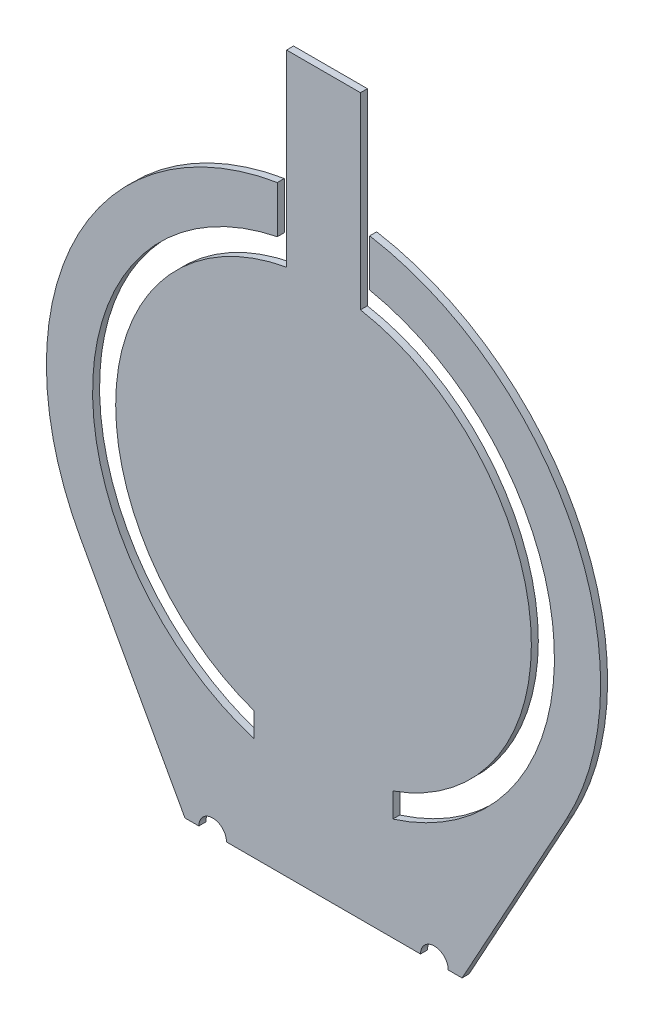
ISO-10303-21;
HEADER;
FILE_DESCRIPTION(('STEP AP214'),'2;1');
FILE_NAME('part.step','',(''),(''),'','','');
FILE_SCHEMA(('AUTOMOTIVE_DESIGN { 1 0 10303 214 1 1 1 1 }'));
ENDSEC;
DATA;
#1=APPLICATION_CONTEXT('core data for automotive mechanical design processes');
#2=APPLICATION_PROTOCOL_DEFINITION('international standard','automotive_design',2000,#1);
#3=PRODUCT_CONTEXT('',#1,'mechanical');
#4=PRODUCT('Part','Part','',(#3));
#5=PRODUCT_RELATED_PRODUCT_CATEGORY('part','',(#4));
#6=PRODUCT_DEFINITION_FORMATION('','',#4);
#7=PRODUCT_DEFINITION_CONTEXT('part definition',#1,'design');
#8=PRODUCT_DEFINITION('design','',#6,#7);
#9=PRODUCT_DEFINITION_SHAPE('','',#8);
#10=(LENGTH_UNIT() NAMED_UNIT(*) SI_UNIT(.MILLI.,.METRE.));
#11=(NAMED_UNIT(*) PLANE_ANGLE_UNIT() SI_UNIT($,.RADIAN.));
#12=(NAMED_UNIT(*) SI_UNIT($,.STERADIAN.) SOLID_ANGLE_UNIT());
#13=UNCERTAINTY_MEASURE_WITH_UNIT(LENGTH_MEASURE(1.E-05),#10,'distance_accuracy_value','');
#14=(GEOMETRIC_REPRESENTATION_CONTEXT(3) GLOBAL_UNCERTAINTY_ASSIGNED_CONTEXT((#13)) GLOBAL_UNIT_ASSIGNED_CONTEXT((#10,
#11,#12)) REPRESENTATION_CONTEXT('',''));
#15=CARTESIAN_POINT('',(0.,0.,0.));
#16=DIRECTION('',(0.,0.,1.));
#17=DIRECTION('',(1.,0.,0.));
#18=AXIS2_PLACEMENT_3D('',#15,#16,#17);
#19=CARTESIAN_POINT('',(0.,0.,0.75438));
#20=DIRECTION('',(0.,0.,1.));
#21=DIRECTION('',(1.,0.,0.));
#22=AXIS2_PLACEMENT_3D('',#19,#20,#21);
#23=PLANE('',#22);
#24=CARTESIAN_POINT('',(-12.,-35.,0.75438));
#25=DIRECTION('',(0.,0.,1.));
#26=DIRECTION('',(1.,0.,0.));
#27=AXIS2_PLACEMENT_3D('',#24,#25,#26);
#28=CIRCLE('',#27,1.5);
#29=CARTESIAN_POINT('',(-10.5,-35.,0.75438));
#30=VERTEX_POINT('',#29);
#31=CARTESIAN_POINT('',(-13.5,-35.,0.75438));
#32=VERTEX_POINT('',#31);
#33=EDGE_CURVE('E182',#30,#32,#28,.T.);
#34=ORIENTED_EDGE('',*,*,#33,.F.);
#35=DIRECTION('',(1.,0.,0.));
#36=VECTOR('',#35,1.);
#37=CARTESIAN_POINT('',(0.,-35.,0.75438));
#38=LINE('',#37,#36);
#39=CARTESIAN_POINT('',(10.5,-35.,0.75438));
#40=VERTEX_POINT('',#39);
#41=EDGE_CURVE('E193',#30,#40,#38,.T.);
#42=ORIENTED_EDGE('',*,*,#41,.T.);
#43=CARTESIAN_POINT('',(12.,-35.,0.75438));
#44=DIRECTION('',(0.,0.,1.));
#45=DIRECTION('',(1.,0.,0.));
#46=AXIS2_PLACEMENT_3D('',#43,#44,#45);
#47=CIRCLE('',#46,1.5);
#48=CARTESIAN_POINT('',(13.5,-35.,0.75438));
#49=VERTEX_POINT('',#48);
#50=EDGE_CURVE('E198',#40,#49,#47,.F.);
#51=ORIENTED_EDGE('',*,*,#50,.T.);
#52=CARTESIAN_POINT('',(15.,-35.,0.75438));
#53=VERTEX_POINT('',#52);
#54=EDGE_CURVE('E203',#49,#53,#38,.T.);
#55=ORIENTED_EDGE('',*,*,#54,.T.);
#56=DIRECTION('',(0.481530219319478,0.876429488254552,0.));
#57=VECTOR('',#56,1.);
#58=CARTESIAN_POINT('',(26.2928846476366,-14.4459065795844,0.75438));
#59=LINE('',#58,#57);
#60=CARTESIAN_POINT('',(26.2928846476366,-14.4459065795843,0.75438));
#61=VERTEX_POINT('',#60);
#62=EDGE_CURVE('E307',#53,#61,#59,.T.);
#63=ORIENTED_EDGE('',*,*,#62,.T.);
#64=CARTESIAN_POINT('',(0.,0.,0.75438));
#65=DIRECTION('',(0.,0.,1.));
#66=DIRECTION('',(1.,0.,0.));
#67=AXIS2_PLACEMENT_3D('',#64,#65,#66);
#68=CIRCLE('',#67,30.);
#69=CARTESIAN_POINT('',(5.,29.5803989154981,0.75438));
#70=VERTEX_POINT('',#69);
#71=EDGE_CURVE('E312',#61,#70,#68,.T.);
#72=ORIENTED_EDGE('',*,*,#71,.T.);
#73=DIRECTION('',(0.,1.,0.));
#74=VECTOR('',#73,1.);
#75=CARTESIAN_POINT('',(5.,0.,0.75438));
#76=LINE('',#75,#74);
#77=CARTESIAN_POINT('',(5.,24.4948974278318,0.75438));
#78=VERTEX_POINT('',#77);
#79=EDGE_CURVE('E349',#78,#70,#76,.T.);
#80=ORIENTED_EDGE('',*,*,#79,.F.);
#81=CARTESIAN_POINT('',(0.,0.,0.75438));
#82=DIRECTION('',(0.,0.,1.));
#83=DIRECTION('',(1.,0.,0.));
#84=AXIS2_PLACEMENT_3D('',#81,#82,#83);
#85=CIRCLE('',#84,25.);
#86=CARTESIAN_POINT('',(7.5,-23.8484800354236,0.75438));
#87=VERTEX_POINT('',#86);
#88=EDGE_CURVE('E333',#87,#78,#85,.T.);
#89=ORIENTED_EDGE('',*,*,#88,.F.);
#90=DIRECTION('',(0.,1.,0.));
#91=VECTOR('',#90,1.);
#92=CARTESIAN_POINT('',(7.5,0.,0.75438));
#93=LINE('',#92,#91);
#94=CARTESIAN_POINT('',(7.5,-21.2132034355964,0.75438));
#95=VERTEX_POINT('',#94);
#96=EDGE_CURVE('E330',#87,#95,#93,.T.);
#97=ORIENTED_EDGE('',*,*,#96,.T.);
#98=CARTESIAN_POINT('',(0.,0.,0.75438));
#99=DIRECTION('',(0.,0.,1.));
#100=DIRECTION('',(1.,0.,0.));
#101=AXIS2_PLACEMENT_3D('',#98,#99,#100);
#102=CIRCLE('',#101,22.5);
#103=CARTESIAN_POINT('',(4.,22.1415898254845,0.75438));
#104=VERTEX_POINT('',#103);
#105=EDGE_CURVE('E323',#95,#104,#102,.T.);
#106=ORIENTED_EDGE('',*,*,#105,.T.);
#107=DIRECTION('',(0.,1.,0.));
#108=VECTOR('',#107,1.);
#109=CARTESIAN_POINT('',(4.,0.,0.75438));
#110=LINE('',#109,#108);
#111=CARTESIAN_POINT('',(4.,42.5,0.75438));
#112=VERTEX_POINT('',#111);
#113=EDGE_CURVE('E379',#104,#112,#110,.T.);
#114=ORIENTED_EDGE('',*,*,#113,.T.);
#115=DIRECTION('',(-1.,0.,0.));
#116=VECTOR('',#115,1.);
#117=CARTESIAN_POINT('',(0.,42.5,0.75438));
#118=LINE('',#117,#116);
#119=CARTESIAN_POINT('',(-4.,42.5,0.75438));
#120=VERTEX_POINT('',#119);
#121=EDGE_CURVE('E375',#112,#120,#118,.T.);
#122=ORIENTED_EDGE('',*,*,#121,.T.);
#123=DIRECTION('',(0.,1.,0.));
#124=VECTOR('',#123,1.);
#125=CARTESIAN_POINT('',(-4.,0.,0.75438));
#126=LINE('',#125,#124);
#127=CARTESIAN_POINT('',(-4.,22.1415898254845,0.75438));
#128=VERTEX_POINT('',#127);
#129=EDGE_CURVE('E370',#128,#120,#126,.T.);
#130=ORIENTED_EDGE('',*,*,#129,.F.);
#131=CARTESIAN_POINT('',(-7.5,-21.2132034355964,0.75438));
#132=VERTEX_POINT('',#131);
#133=EDGE_CURVE('E329',#128,#132,#102,.T.);
#134=ORIENTED_EDGE('',*,*,#133,.T.);
#135=DIRECTION('',(0.,1.,0.));
#136=VECTOR('',#135,1.);
#137=CARTESIAN_POINT('',(-7.5,0.,0.75438));
#138=LINE('',#137,#136);
#139=CARTESIAN_POINT('',(-7.5,-23.8484800354236,0.75438));
#140=VERTEX_POINT('',#139);
#141=EDGE_CURVE('E318',#140,#132,#138,.T.);
#142=ORIENTED_EDGE('',*,*,#141,.F.);
#143=CARTESIAN_POINT('',(-5.,24.4948974278318,0.75438));
#144=VERTEX_POINT('',#143);
#145=EDGE_CURVE('E247',#144,#140,#85,.T.);
#146=ORIENTED_EDGE('',*,*,#145,.F.);
#147=DIRECTION('',(0.,1.,0.));
#148=VECTOR('',#147,1.);
#149=CARTESIAN_POINT('',(-5.,0.,0.75438));
#150=LINE('',#149,#148);
#151=CARTESIAN_POINT('',(-5.,29.5803989154981,0.75438));
#152=VERTEX_POINT('',#151);
#153=EDGE_CURVE('E352',#144,#152,#150,.T.);
#154=ORIENTED_EDGE('',*,*,#153,.T.);
#155=CARTESIAN_POINT('',(-26.2928846476366,-14.4459065795843,0.75438));
#156=VERTEX_POINT('',#155);
#157=EDGE_CURVE('E316',#152,#156,#68,.T.);
#158=ORIENTED_EDGE('',*,*,#157,.T.);
#159=DIRECTION('',(-0.481530219319478,0.876429488254552,0.));
#160=VECTOR('',#159,1.);
#161=CARTESIAN_POINT('',(-26.2928846476366,-14.4459065795843,0.75438));
#162=LINE('',#161,#160);
#163=CARTESIAN_POINT('',(-15.,-35.,0.75438));
#164=VERTEX_POINT('',#163);
#165=EDGE_CURVE('E208',#164,#156,#162,.T.);
#166=ORIENTED_EDGE('',*,*,#165,.F.);
#167=EDGE_CURVE('E196',#164,#32,#38,.T.);
#168=ORIENTED_EDGE('',*,*,#167,.T.);
#169=EDGE_LOOP('',(#34,#42,#51,#55,#63,#72,#80,#89,#97,#106,#114,#122,#130,#134,#142,#146,#154,
#158,#166,#168));
#170=FACE_BOUND('',#169,.T.);
#171=ADVANCED_FACE('F45',(#170),#23,.T.);
#172=CARTESIAN_POINT('',(0.,0.,0.));
#173=DIRECTION('',(0.,0.,1.));
#174=DIRECTION('',(1.,0.,0.));
#175=AXIS2_PLACEMENT_3D('',#172,#173,#174);
#176=PLANE('',#175);
#177=DIRECTION('',(1.,0.,0.));
#178=VECTOR('',#177,1.);
#179=CARTESIAN_POINT('',(0.,-35.,0.));
#180=LINE('',#179,#178);
#181=CARTESIAN_POINT('',(-10.5,-35.,0.));
#182=VERTEX_POINT('',#181);
#183=CARTESIAN_POINT('',(10.5,-35.,0.));
#184=VERTEX_POINT('',#183);
#185=EDGE_CURVE('E248',#182,#184,#180,.T.);
#186=ORIENTED_EDGE('',*,*,#185,.F.);
#187=CARTESIAN_POINT('',(-12.,-35.,0.));
#188=DIRECTION('',(0.,0.,1.));
#189=DIRECTION('',(1.,0.,0.));
#190=AXIS2_PLACEMENT_3D('',#187,#188,#189);
#191=CIRCLE('',#190,1.5);
#192=CARTESIAN_POINT('',(-13.5,-35.,0.));
#193=VERTEX_POINT('',#192);
#194=EDGE_CURVE('E69',#182,#193,#191,.T.);
#195=ORIENTED_EDGE('',*,*,#194,.T.);
#196=CARTESIAN_POINT('',(-15.,-35.,0.));
#197=VERTEX_POINT('',#196);
#198=EDGE_CURVE('E243',#197,#193,#180,.T.);
#199=ORIENTED_EDGE('',*,*,#198,.F.);
#200=DIRECTION('',(-0.481530219319478,0.876429488254552,0.));
#201=VECTOR('',#200,1.);
#202=CARTESIAN_POINT('',(-26.2928846476366,-14.4459065795843,0.));
#203=LINE('',#202,#201);
#204=CARTESIAN_POINT('',(-26.2928846476366,-14.4459065795843,0.));
#205=VERTEX_POINT('',#204);
#206=EDGE_CURVE('E238',#197,#205,#203,.T.);
#207=ORIENTED_EDGE('',*,*,#206,.T.);
#208=CARTESIAN_POINT('',(0.,0.,0.));
#209=DIRECTION('',(0.,0.,1.));
#210=DIRECTION('',(1.,0.,0.));
#211=AXIS2_PLACEMENT_3D('',#208,#209,#210);
#212=CIRCLE('',#211,30.);
#213=CARTESIAN_POINT('',(-5.,29.5803989154981,0.));
#214=VERTEX_POINT('',#213);
#215=EDGE_CURVE('E233',#214,#205,#212,.T.);
#216=ORIENTED_EDGE('',*,*,#215,.F.);
#217=DIRECTION('',(0.,1.,0.));
#218=VECTOR('',#217,1.);
#219=CARTESIAN_POINT('',(-5.,0.,0.));
#220=LINE('',#219,#218);
#221=CARTESIAN_POINT('',(-5.,24.4948974278318,0.));
#222=VERTEX_POINT('',#221);
#223=EDGE_CURVE('E282',#222,#214,#220,.T.);
#224=ORIENTED_EDGE('',*,*,#223,.F.);
#225=CARTESIAN_POINT('',(0.,0.,0.));
#226=DIRECTION('',(0.,0.,1.));
#227=DIRECTION('',(1.,0.,0.));
#228=AXIS2_PLACEMENT_3D('',#225,#226,#227);
#229=CIRCLE('',#228,25.);
#230=CARTESIAN_POINT('',(-7.5,-23.8484800354236,0.));
#231=VERTEX_POINT('',#230);
#232=EDGE_CURVE('E217',#222,#231,#229,.T.);
#233=ORIENTED_EDGE('',*,*,#232,.T.);
#234=DIRECTION('',(0.,1.,0.));
#235=VECTOR('',#234,1.);
#236=CARTESIAN_POINT('',(-7.5,0.,0.));
#237=LINE('',#236,#235);
#238=CARTESIAN_POINT('',(-7.5,-21.2132034355964,0.));
#239=VERTEX_POINT('',#238);
#240=EDGE_CURVE('E225',#231,#239,#237,.T.);
#241=ORIENTED_EDGE('',*,*,#240,.T.);
#242=CARTESIAN_POINT('',(0.,0.,0.));
#243=DIRECTION('',(0.,0.,1.));
#244=DIRECTION('',(1.,0.,0.));
#245=AXIS2_PLACEMENT_3D('',#242,#243,#244);
#246=CIRCLE('',#245,22.5);
#247=CARTESIAN_POINT('',(-4.,22.1415898254845,0.));
#248=VERTEX_POINT('',#247);
#249=EDGE_CURVE('E220',#248,#239,#246,.T.);
#250=ORIENTED_EDGE('',*,*,#249,.F.);
#251=DIRECTION('',(0.,1.,0.));
#252=VECTOR('',#251,1.);
#253=CARTESIAN_POINT('',(-4.,0.,0.));
#254=LINE('',#253,#252);
#255=CARTESIAN_POINT('',(-4.,42.5,0.));
#256=VERTEX_POINT('',#255);
#257=EDGE_CURVE('E362',#248,#256,#254,.T.);
#258=ORIENTED_EDGE('',*,*,#257,.T.);
#259=DIRECTION('',(-1.,0.,0.));
#260=VECTOR('',#259,1.);
#261=CARTESIAN_POINT('',(0.,42.5,0.));
#262=LINE('',#261,#260);
#263=CARTESIAN_POINT('',(4.,42.5,0.));
#264=VERTEX_POINT('',#263);
#265=EDGE_CURVE('E385',#264,#256,#262,.T.);
#266=ORIENTED_EDGE('',*,*,#265,.F.);
#267=DIRECTION('',(0.,1.,0.));
#268=VECTOR('',#267,1.);
#269=CARTESIAN_POINT('',(4.,0.,0.));
#270=LINE('',#269,#268);
#271=CARTESIAN_POINT('',(4.,22.1415898254845,0.));
#272=VERTEX_POINT('',#271);
#273=EDGE_CURVE('E374',#272,#264,#270,.T.);
#274=ORIENTED_EDGE('',*,*,#273,.F.);
#275=CARTESIAN_POINT('',(7.5,-21.2132034355964,0.));
#276=VERTEX_POINT('',#275);
#277=EDGE_CURVE('E221',#276,#272,#246,.T.);
#278=ORIENTED_EDGE('',*,*,#277,.F.);
#279=DIRECTION('',(0.,1.,0.));
#280=VECTOR('',#279,1.);
#281=CARTESIAN_POINT('',(7.5,0.,0.));
#282=LINE('',#281,#280);
#283=CARTESIAN_POINT('',(7.5,-23.8484800354236,0.));
#284=VERTEX_POINT('',#283);
#285=EDGE_CURVE('E216',#284,#276,#282,.T.);
#286=ORIENTED_EDGE('',*,*,#285,.F.);
#287=CARTESIAN_POINT('',(5.,24.4948974278318,0.));
#288=VERTEX_POINT('',#287);
#289=EDGE_CURVE('E212',#284,#288,#229,.T.);
#290=ORIENTED_EDGE('',*,*,#289,.T.);
#291=DIRECTION('',(0.,1.,0.));
#292=VECTOR('',#291,1.);
#293=CARTESIAN_POINT('',(5.,0.,0.));
#294=LINE('',#293,#292);
#295=CARTESIAN_POINT('',(5.,29.5803989154981,0.));
#296=VERTEX_POINT('',#295);
#297=EDGE_CURVE('E265',#288,#296,#294,.T.);
#298=ORIENTED_EDGE('',*,*,#297,.T.);
#299=CARTESIAN_POINT('',(26.2928846476366,-14.4459065795843,0.));
#300=VERTEX_POINT('',#299);
#301=EDGE_CURVE('E234',#300,#296,#212,.T.);
#302=ORIENTED_EDGE('',*,*,#301,.F.);
#303=DIRECTION('',(0.481530219319478,0.876429488254552,0.));
#304=VECTOR('',#303,1.);
#305=CARTESIAN_POINT('',(26.2928846476366,-14.4459065795844,0.));
#306=LINE('',#305,#304);
#307=CARTESIAN_POINT('',(15.,-35.,0.));
#308=VERTEX_POINT('',#307);
#309=EDGE_CURVE('E229',#308,#300,#306,.T.);
#310=ORIENTED_EDGE('',*,*,#309,.F.);
#311=CARTESIAN_POINT('',(13.5,-35.,0.));
#312=VERTEX_POINT('',#311);
#313=EDGE_CURVE('E242',#312,#308,#180,.T.);
#314=ORIENTED_EDGE('',*,*,#313,.F.);
#315=CARTESIAN_POINT('',(12.,-35.,0.));
#316=DIRECTION('',(0.,0.,1.));
#317=DIRECTION('',(1.,0.,0.));
#318=AXIS2_PLACEMENT_3D('',#315,#316,#317);
#319=CIRCLE('',#318,1.5);
#320=EDGE_CURVE('E61',#184,#312,#319,.F.);
#321=ORIENTED_EDGE('',*,*,#320,.F.);
#322=EDGE_LOOP('',(#186,#195,#199,#207,#216,#224,#233,#241,#250,#258,#266,#274,#278,#286,#290,
#298,#302,#310,#314,#321));
#323=FACE_BOUND('',#322,.T.);
#324=ADVANCED_FACE('F292',(#323),#176,.F.);
#325=CARTESIAN_POINT('',(0.,-35.,0.75438));
#326=DIRECTION('',(0.,1.,0.));
#327=DIRECTION('',(0.,0.,1.));
#328=AXIS2_PLACEMENT_3D('',#325,#326,#327);
#329=PLANE('',#328);
#330=ORIENTED_EDGE('',*,*,#198,.T.);
#331=DIRECTION('',(0.,0.,1.));
#332=VECTOR('',#331,1.);
#333=CARTESIAN_POINT('',(-13.5,-35.,-9.24562));
#334=LINE('',#333,#332);
#335=EDGE_CURVE('E11',#193,#32,#334,.T.);
#336=ORIENTED_EDGE('',*,*,#335,.T.);
#337=ORIENTED_EDGE('',*,*,#167,.F.);
#338=DIRECTION('',(0.,0.,-1.));
#339=VECTOR('',#338,1.);
#340=CARTESIAN_POINT('',(-15.,-35.,0.75438));
#341=LINE('',#340,#339);
#342=EDGE_CURVE('E253',#164,#197,#341,.T.);
#343=ORIENTED_EDGE('',*,*,#342,.T.);
#344=EDGE_LOOP('',(#330,#336,#337,#343));
#345=FACE_BOUND('',#344,.T.);
#346=ADVANCED_FACE('F411',(#345),#329,.F.);
#347=ORIENTED_EDGE('',*,*,#41,.F.);
#348=DIRECTION('',(0.,0.,1.));
#349=VECTOR('',#348,1.);
#350=CARTESIAN_POINT('',(-10.5,-35.,-9.24562));
#351=LINE('',#350,#349);
#352=EDGE_CURVE('E54',#30,#182,#351,.F.);
#353=ORIENTED_EDGE('',*,*,#352,.T.);
#354=ORIENTED_EDGE('',*,*,#185,.T.);
#355=DIRECTION('',(0.,0.,1.));
#356=VECTOR('',#355,1.);
#357=CARTESIAN_POINT('',(10.5,-35.,-9.24562));
#358=LINE('',#357,#356);
#359=EDGE_CURVE('E188',#40,#184,#358,.F.);
#360=ORIENTED_EDGE('',*,*,#359,.F.);
#361=EDGE_LOOP('',(#347,#353,#354,#360));
#362=FACE_BOUND('',#361,.T.);
#363=ADVANCED_FACE('F201',(#362),#329,.F.);
#364=DIRECTION('',(0.,0.,1.));
#365=VECTOR('',#364,1.);
#366=CARTESIAN_POINT('',(13.5,-35.,-9.24562));
#367=LINE('',#366,#365);
#368=EDGE_CURVE('E285',#312,#49,#367,.T.);
#369=ORIENTED_EDGE('',*,*,#368,.F.);
#370=ORIENTED_EDGE('',*,*,#313,.T.);
#371=DIRECTION('',(0.,0.,-1.));
#372=VECTOR('',#371,1.);
#373=CARTESIAN_POINT('',(15.,-35.,0.75438));
#374=LINE('',#373,#372);
#375=EDGE_CURVE('E249',#53,#308,#374,.T.);
#376=ORIENTED_EDGE('',*,*,#375,.F.);
#377=ORIENTED_EDGE('',*,*,#54,.F.);
#378=EDGE_LOOP('',(#369,#370,#376,#377));
#379=FACE_BOUND('',#378,.T.);
#380=ADVANCED_FACE('F300',(#379),#329,.F.);
#381=CARTESIAN_POINT('',(0.,0.,0.75438));
#382=DIRECTION('',(0.,0.,-1.));
#383=DIRECTION('',(-1.,0.,0.));
#384=AXIS2_PLACEMENT_3D('',#381,#382,#383);
#385=CYLINDRICAL_SURFACE('',#384,22.5);
#386=DIRECTION('',(0.,0.,1.));
#387=VECTOR('',#386,1.);
#388=CARTESIAN_POINT('',(-4.,22.1415898254845,0.));
#389=LINE('',#388,#387);
#390=EDGE_CURVE('E356',#248,#128,#389,.T.);
#391=ORIENTED_EDGE('',*,*,#390,.F.);
#392=ORIENTED_EDGE('',*,*,#249,.T.);
#393=DIRECTION('',(0.,0.,-1.));
#394=VECTOR('',#393,1.);
#395=CARTESIAN_POINT('',(-7.5,-21.2132034355964,0.75438));
#396=LINE('',#395,#394);
#397=EDGE_CURVE('E269',#132,#239,#396,.T.);
#398=ORIENTED_EDGE('',*,*,#397,.F.);
#399=ORIENTED_EDGE('',*,*,#133,.F.);
#400=EDGE_LOOP('',(#391,#392,#398,#399));
#401=FACE_BOUND('',#400,.T.);
#402=ADVANCED_FACE('F429',(#401),#385,.T.);
#403=CARTESIAN_POINT('',(0.,0.,0.75438));
#404=DIRECTION('',(0.,0.,-1.));
#405=DIRECTION('',(-1.,0.,0.));
#406=AXIS2_PLACEMENT_3D('',#403,#404,#405);
#407=CYLINDRICAL_SURFACE('',#406,30.);
#408=DIRECTION('',(0.,0.,-1.));
#409=VECTOR('',#408,1.);
#410=CARTESIAN_POINT('',(-5.,29.5803989154981,0.75438));
#411=LINE('',#410,#409);
#412=EDGE_CURVE('E337',#214,#152,#411,.F.);
#413=ORIENTED_EDGE('',*,*,#412,.F.);
#414=ORIENTED_EDGE('',*,*,#215,.T.);
#415=DIRECTION('',(0.,0.,-1.));
#416=VECTOR('',#415,1.);
#417=CARTESIAN_POINT('',(-26.2928846476366,-14.4459065795843,0.75438));
#418=LINE('',#417,#416);
#419=EDGE_CURVE('E257',#156,#205,#418,.T.);
#420=ORIENTED_EDGE('',*,*,#419,.F.);
#421=ORIENTED_EDGE('',*,*,#157,.F.);
#422=EDGE_LOOP('',(#413,#414,#420,#421));
#423=FACE_BOUND('',#422,.T.);
#424=ADVANCED_FACE('F402',(#423),#407,.T.);
#425=CARTESIAN_POINT('',(0.,0.,0.75438));
#426=DIRECTION('',(0.,0.,-1.));
#427=DIRECTION('',(-1.,0.,0.));
#428=AXIS2_PLACEMENT_3D('',#425,#426,#427);
#429=CYLINDRICAL_SURFACE('',#428,25.);
#430=ORIENTED_EDGE('',*,*,#232,.F.);
#431=DIRECTION('',(0.,0.,-1.));
#432=VECTOR('',#431,1.);
#433=CARTESIAN_POINT('',(-5.,24.4948974278318,0.75438));
#434=LINE('',#433,#432);
#435=EDGE_CURVE('E340',#222,#144,#434,.F.);
#436=ORIENTED_EDGE('',*,*,#435,.T.);
#437=ORIENTED_EDGE('',*,*,#145,.T.);
#438=DIRECTION('',(0.,0.,-1.));
#439=VECTOR('',#438,1.);
#440=CARTESIAN_POINT('',(-7.5,-23.8484800354236,0.75438));
#441=LINE('',#440,#439);
#442=EDGE_CURVE('E207',#140,#231,#441,.T.);
#443=ORIENTED_EDGE('',*,*,#442,.T.);
#444=EDGE_LOOP('',(#430,#436,#437,#443));
#445=FACE_BOUND('',#444,.T.);
#446=ADVANCED_FACE('F419',(#445),#429,.F.);
#447=CARTESIAN_POINT('',(26.2928846476366,-14.4459065795844,0.75438));
#448=DIRECTION('',(-0.876429488254551,0.481530219319478,0.));
#449=DIRECTION('',(-0.481530219319478,-0.876429488254552,0.));
#450=AXIS2_PLACEMENT_3D('',#447,#448,#449);
#451=PLANE('',#450);
#452=ORIENTED_EDGE('',*,*,#309,.T.);
#453=DIRECTION('',(0.,0.,-1.));
#454=VECTOR('',#453,1.);
#455=CARTESIAN_POINT('',(26.2928846476366,-14.4459065795843,0.75438));
#456=LINE('',#455,#454);
#457=EDGE_CURVE('E261',#61,#300,#456,.T.);
#458=ORIENTED_EDGE('',*,*,#457,.F.);
#459=ORIENTED_EDGE('',*,*,#62,.F.);
#460=ORIENTED_EDGE('',*,*,#375,.T.);
#461=EDGE_LOOP('',(#452,#458,#459,#460));
#462=FACE_BOUND('',#461,.T.);
#463=ADVANCED_FACE('F304',(#462),#451,.F.);
#464=ORIENTED_EDGE('',*,*,#301,.T.);
#465=DIRECTION('',(0.,0.,-1.));
#466=VECTOR('',#465,1.);
#467=CARTESIAN_POINT('',(5.,29.5803989154981,0.75438));
#468=LINE('',#467,#466);
#469=EDGE_CURVE('E313',#296,#70,#468,.F.);
#470=ORIENTED_EDGE('',*,*,#469,.T.);
#471=ORIENTED_EDGE('',*,*,#71,.F.);
#472=ORIENTED_EDGE('',*,*,#457,.T.);
#473=EDGE_LOOP('',(#464,#470,#471,#472));
#474=FACE_BOUND('',#473,.T.);
#475=ADVANCED_FACE('F310',(#474),#407,.T.);
#476=CARTESIAN_POINT('',(-26.2928846476366,-14.4459065795843,0.75438));
#477=DIRECTION('',(-0.876429488254552,-0.481530219319478,0.));
#478=DIRECTION('',(0.481530219319478,-0.876429488254552,0.));
#479=AXIS2_PLACEMENT_3D('',#476,#477,#478);
#480=PLANE('',#479);
#481=ORIENTED_EDGE('',*,*,#206,.F.);
#482=ORIENTED_EDGE('',*,*,#342,.F.);
#483=ORIENTED_EDGE('',*,*,#165,.T.);
#484=ORIENTED_EDGE('',*,*,#419,.T.);
#485=EDGE_LOOP('',(#481,#482,#483,#484));
#486=FACE_BOUND('',#485,.T.);
#487=ADVANCED_FACE('F408',(#486),#480,.T.);
#488=DIRECTION('',(0.,0.,-1.));
#489=VECTOR('',#488,1.);
#490=CARTESIAN_POINT('',(5.,24.4948974278318,0.75438));
#491=LINE('',#490,#489);
#492=EDGE_CURVE('E346',#288,#78,#491,.F.);
#493=ORIENTED_EDGE('',*,*,#492,.F.);
#494=ORIENTED_EDGE('',*,*,#289,.F.);
#495=DIRECTION('',(0.,0.,-1.));
#496=VECTOR('',#495,1.);
#497=CARTESIAN_POINT('',(7.5,-23.8484800354236,0.75438));
#498=LINE('',#497,#496);
#499=EDGE_CURVE('E254',#87,#284,#498,.T.);
#500=ORIENTED_EDGE('',*,*,#499,.F.);
#501=ORIENTED_EDGE('',*,*,#88,.T.);
#502=EDGE_LOOP('',(#493,#494,#500,#501));
#503=FACE_BOUND('',#502,.T.);
#504=ADVANCED_FACE('F47',(#503),#429,.F.);
#505=CARTESIAN_POINT('',(7.5,0.,0.75438));
#506=DIRECTION('',(-1.,0.,0.));
#507=DIRECTION('',(0.,0.,1.));
#508=AXIS2_PLACEMENT_3D('',#505,#506,#507);
#509=PLANE('',#508);
#510=ORIENTED_EDGE('',*,*,#285,.T.);
#511=DIRECTION('',(0.,0.,-1.));
#512=VECTOR('',#511,1.);
#513=CARTESIAN_POINT('',(7.5,-21.2132034355964,0.75438));
#514=LINE('',#513,#512);
#515=EDGE_CURVE('E273',#95,#276,#514,.T.);
#516=ORIENTED_EDGE('',*,*,#515,.F.);
#517=ORIENTED_EDGE('',*,*,#96,.F.);
#518=ORIENTED_EDGE('',*,*,#499,.T.);
#519=EDGE_LOOP('',(#510,#516,#517,#518));
#520=FACE_BOUND('',#519,.T.);
#521=ADVANCED_FACE('F449',(#520),#509,.F.);
#522=ORIENTED_EDGE('',*,*,#277,.T.);
#523=DIRECTION('',(0.,0.,1.));
#524=VECTOR('',#523,1.);
#525=CARTESIAN_POINT('',(4.,22.1415898254845,0.));
#526=LINE('',#525,#524);
#527=EDGE_CURVE('E357',#272,#104,#526,.T.);
#528=ORIENTED_EDGE('',*,*,#527,.T.);
#529=ORIENTED_EDGE('',*,*,#105,.F.);
#530=ORIENTED_EDGE('',*,*,#515,.T.);
#531=EDGE_LOOP('',(#522,#528,#529,#530));
#532=FACE_BOUND('',#531,.T.);
#533=ADVANCED_FACE('F444',(#532),#385,.T.);
#534=CARTESIAN_POINT('',(-7.5,0.,0.75438));
#535=DIRECTION('',(-1.,0.,0.));
#536=DIRECTION('',(0.,0.,1.));
#537=AXIS2_PLACEMENT_3D('',#534,#535,#536);
#538=PLANE('',#537);
#539=ORIENTED_EDGE('',*,*,#240,.F.);
#540=ORIENTED_EDGE('',*,*,#442,.F.);
#541=ORIENTED_EDGE('',*,*,#141,.T.);
#542=ORIENTED_EDGE('',*,*,#397,.T.);
#543=EDGE_LOOP('',(#539,#540,#541,#542));
#544=FACE_BOUND('',#543,.T.);
#545=ADVANCED_FACE('F424',(#544),#538,.T.);
#546=CARTESIAN_POINT('',(5.,0.,-9.24562));
#547=DIRECTION('',(1.,0.,0.));
#548=DIRECTION('',(0.,0.,-1.));
#549=AXIS2_PLACEMENT_3D('',#546,#547,#548);
#550=PLANE('',#549);
#551=ORIENTED_EDGE('',*,*,#297,.F.);
#552=ORIENTED_EDGE('',*,*,#492,.T.);
#553=ORIENTED_EDGE('',*,*,#79,.T.);
#554=ORIENTED_EDGE('',*,*,#469,.F.);
#555=EDGE_LOOP('',(#551,#552,#553,#554));
#556=FACE_BOUND('',#555,.T.);
#557=ADVANCED_FACE('F455',(#556),#550,.F.);
#558=CARTESIAN_POINT('',(-5.,0.,-9.24562));
#559=DIRECTION('',(1.,0.,0.));
#560=DIRECTION('',(0.,0.,-1.));
#561=AXIS2_PLACEMENT_3D('',#558,#559,#560);
#562=PLANE('',#561);
#563=ORIENTED_EDGE('',*,*,#412,.T.);
#564=ORIENTED_EDGE('',*,*,#153,.F.);
#565=ORIENTED_EDGE('',*,*,#435,.F.);
#566=ORIENTED_EDGE('',*,*,#223,.T.);
#567=EDGE_LOOP('',(#563,#564,#565,#566));
#568=FACE_BOUND('',#567,.T.);
#569=ADVANCED_FACE('F416',(#568),#562,.T.);
#570=CARTESIAN_POINT('',(-4.,0.,0.));
#571=DIRECTION('',(1.,0.,0.));
#572=DIRECTION('',(0.,0.,-1.));
#573=AXIS2_PLACEMENT_3D('',#570,#571,#572);
#574=PLANE('',#573);
#575=ORIENTED_EDGE('',*,*,#129,.T.);
#576=DIRECTION('',(0.,0.,1.));
#577=VECTOR('',#576,1.);
#578=CARTESIAN_POINT('',(-4.,42.5,0.));
#579=LINE('',#578,#577);
#580=EDGE_CURVE('E365',#256,#120,#579,.T.);
#581=ORIENTED_EDGE('',*,*,#580,.F.);
#582=ORIENTED_EDGE('',*,*,#257,.F.);
#583=ORIENTED_EDGE('',*,*,#390,.T.);
#584=EDGE_LOOP('',(#575,#581,#582,#583));
#585=FACE_BOUND('',#584,.T.);
#586=ADVANCED_FACE('F432',(#585),#574,.F.);
#587=CARTESIAN_POINT('',(0.,42.5,0.));
#588=DIRECTION('',(0.,1.,0.));
#589=DIRECTION('',(0.,0.,1.));
#590=AXIS2_PLACEMENT_3D('',#587,#588,#589);
#591=PLANE('',#590);
#592=ORIENTED_EDGE('',*,*,#121,.F.);
#593=DIRECTION('',(0.,0.,1.));
#594=VECTOR('',#593,1.);
#595=CARTESIAN_POINT('',(4.,42.5,0.));
#596=LINE('',#595,#594);
#597=EDGE_CURVE('E361',#264,#112,#596,.T.);
#598=ORIENTED_EDGE('',*,*,#597,.F.);
#599=ORIENTED_EDGE('',*,*,#265,.T.);
#600=ORIENTED_EDGE('',*,*,#580,.T.);
#601=EDGE_LOOP('',(#592,#598,#599,#600));
#602=FACE_BOUND('',#601,.T.);
#603=ADVANCED_FACE('F436',(#602),#591,.T.);
#604=CARTESIAN_POINT('',(4.,0.,0.));
#605=DIRECTION('',(1.,0.,0.));
#606=DIRECTION('',(0.,0.,-1.));
#607=AXIS2_PLACEMENT_3D('',#604,#605,#606);
#608=PLANE('',#607);
#609=ORIENTED_EDGE('',*,*,#113,.F.);
#610=ORIENTED_EDGE('',*,*,#527,.F.);
#611=ORIENTED_EDGE('',*,*,#273,.T.);
#612=ORIENTED_EDGE('',*,*,#597,.T.);
#613=EDGE_LOOP('',(#609,#610,#611,#612));
#614=FACE_BOUND('',#613,.T.);
#615=ADVANCED_FACE('F441',(#614),#608,.T.);
#616=CARTESIAN_POINT('',(12.,-35.,-9.24562));
#617=DIRECTION('',(0.,0.,1.));
#618=DIRECTION('',(1.,0.,0.));
#619=AXIS2_PLACEMENT_3D('',#616,#617,#618);
#620=CYLINDRICAL_SURFACE('',#619,1.5);
#621=ORIENTED_EDGE('',*,*,#320,.T.);
#622=ORIENTED_EDGE('',*,*,#368,.T.);
#623=ORIENTED_EDGE('',*,*,#50,.F.);
#624=ORIENTED_EDGE('',*,*,#359,.T.);
#625=EDGE_LOOP('',(#621,#622,#623,#624));
#626=FACE_BOUND('',#625,.T.);
#627=ADVANCED_FACE('F289',(#626),#620,.F.);
#628=CARTESIAN_POINT('',(-12.,-35.,-9.24562));
#629=DIRECTION('',(0.,0.,1.));
#630=DIRECTION('',(1.,0.,0.));
#631=AXIS2_PLACEMENT_3D('',#628,#629,#630);
#632=CYLINDRICAL_SURFACE('',#631,1.5);
#633=ORIENTED_EDGE('',*,*,#352,.F.);
#634=ORIENTED_EDGE('',*,*,#33,.T.);
#635=ORIENTED_EDGE('',*,*,#335,.F.);
#636=ORIENTED_EDGE('',*,*,#194,.F.);
#637=EDGE_LOOP('',(#633,#634,#635,#636));
#638=FACE_BOUND('',#637,.T.);
#639=ADVANCED_FACE('F181',(#638),#632,.F.);
#640=CLOSED_SHELL('',(#171,#324,#346,#363,#380,#402,#424,#446,#463,#475,#487,#504,#521,#533,
#545,#557,#569,#586,#603,#615,#627,#639));
#641=MANIFOLD_SOLID_BREP('B2',#640);
#642=ADVANCED_BREP_SHAPE_REPRESENTATION('',(#18,#641),#14);
#643=SHAPE_DEFINITION_REPRESENTATION(#9,#642);
ENDSEC;
END-ISO-10303-21;
